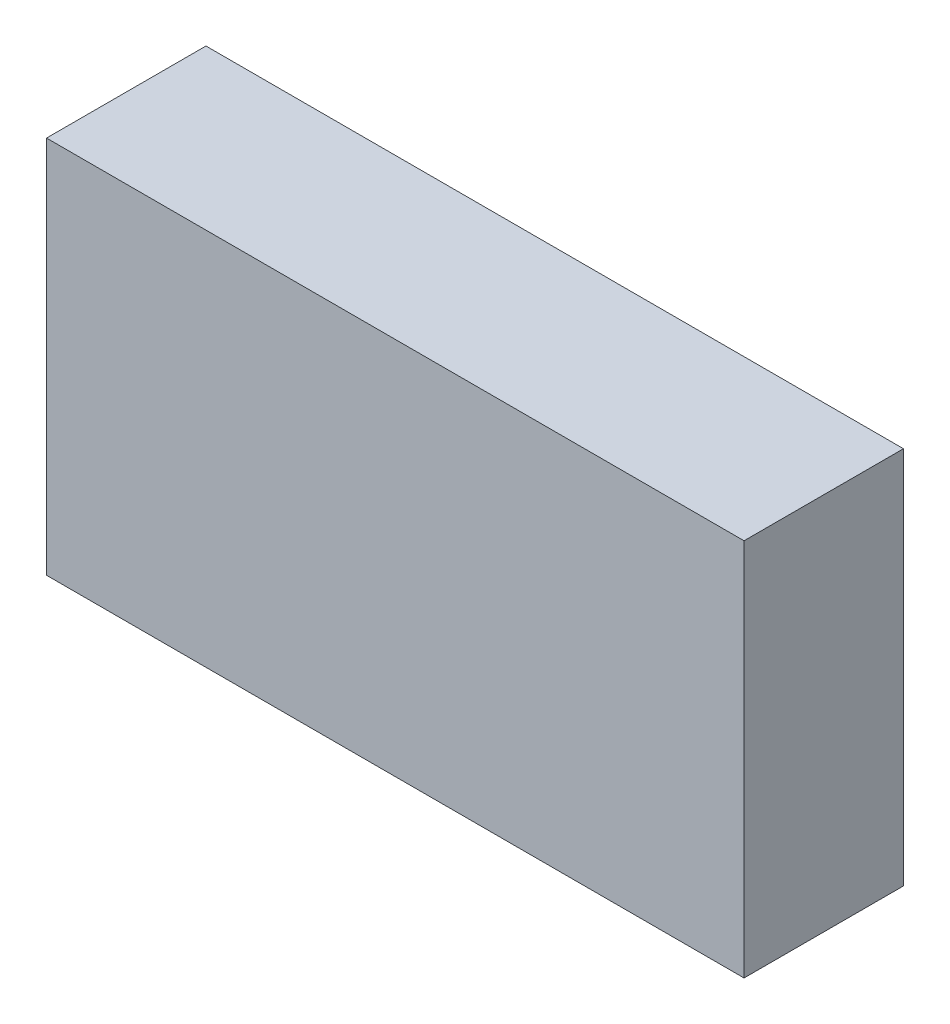
ISO-10303-21;
HEADER;
FILE_DESCRIPTION(('STEP AP214'),'2;1');
FILE_NAME('part.step','',(''),(''),'','','');
FILE_SCHEMA(('AUTOMOTIVE_DESIGN { 1 0 10303 214 1 1 1 1 }'));
ENDSEC;
DATA;
#1=APPLICATION_CONTEXT('core data for automotive mechanical design processes');
#2=APPLICATION_PROTOCOL_DEFINITION('international standard','automotive_design',2000,#1);
#3=PRODUCT_CONTEXT('',#1,'mechanical');
#4=PRODUCT('Part','Part','',(#3));
#5=PRODUCT_RELATED_PRODUCT_CATEGORY('part','',(#4));
#6=PRODUCT_DEFINITION_FORMATION('','',#4);
#7=PRODUCT_DEFINITION_CONTEXT('part definition',#1,'design');
#8=PRODUCT_DEFINITION('design','',#6,#7);
#9=PRODUCT_DEFINITION_SHAPE('','',#8);
#10=(LENGTH_UNIT() NAMED_UNIT(*) SI_UNIT(.MILLI.,.METRE.));
#11=(NAMED_UNIT(*) PLANE_ANGLE_UNIT() SI_UNIT($,.RADIAN.));
#12=(NAMED_UNIT(*) SI_UNIT($,.STERADIAN.) SOLID_ANGLE_UNIT());
#13=UNCERTAINTY_MEASURE_WITH_UNIT(LENGTH_MEASURE(1.E-05),#10,'distance_accuracy_value','');
#14=(GEOMETRIC_REPRESENTATION_CONTEXT(3) GLOBAL_UNCERTAINTY_ASSIGNED_CONTEXT((#13)) GLOBAL_UNIT_ASSIGNED_CONTEXT((#10,
#11,#12)) REPRESENTATION_CONTEXT('',''));
#15=CARTESIAN_POINT('',(0.,0.,0.));
#16=DIRECTION('',(0.,0.,1.));
#17=DIRECTION('',(1.,0.,0.));
#18=AXIS2_PLACEMENT_3D('',#15,#16,#17);
#19=CARTESIAN_POINT('',(-0.875,0.475,0.4));
#20=DIRECTION('',(1.,0.,0.));
#21=DIRECTION('',(0.,0.,-1.));
#22=AXIS2_PLACEMENT_3D('',#19,#20,#21);
#23=PLANE('',#22);
#24=DIRECTION('',(0.,-1.,0.));
#25=VECTOR('',#24,1.);
#26=CARTESIAN_POINT('',(-0.875,0.475,0.));
#27=LINE('',#26,#25);
#28=CARTESIAN_POINT('',(-0.875,0.475,0.));
#29=VERTEX_POINT('',#28);
#30=CARTESIAN_POINT('',(-0.875,-0.475,0.));
#31=VERTEX_POINT('',#30);
#32=EDGE_CURVE('E97',#29,#31,#27,.T.);
#33=ORIENTED_EDGE('',*,*,#32,.T.);
#34=DIRECTION('',(0.,0.,-1.));
#35=VECTOR('',#34,1.);
#36=CARTESIAN_POINT('',(-0.875,-0.475,0.4));
#37=LINE('',#36,#35);
#38=CARTESIAN_POINT('',(-0.875,-0.475,0.4));
#39=VERTEX_POINT('',#38);
#40=EDGE_CURVE('E11',#39,#31,#37,.T.);
#41=ORIENTED_EDGE('',*,*,#40,.F.);
#42=DIRECTION('',(0.,-1.,0.));
#43=VECTOR('',#42,1.);
#44=CARTESIAN_POINT('',(-0.875,0.475,0.4));
#45=LINE('',#44,#43);
#46=CARTESIAN_POINT('',(-0.875,0.475,0.4));
#47=VERTEX_POINT('',#46);
#48=EDGE_CURVE('E85',#47,#39,#45,.T.);
#49=ORIENTED_EDGE('',*,*,#48,.F.);
#50=DIRECTION('',(0.,0.,-1.));
#51=VECTOR('',#50,1.);
#52=CARTESIAN_POINT('',(-0.875,0.475,0.4));
#53=LINE('',#52,#51);
#54=EDGE_CURVE('E93',#47,#29,#53,.T.);
#55=ORIENTED_EDGE('',*,*,#54,.T.);
#56=EDGE_LOOP('',(#33,#41,#49,#55));
#57=FACE_BOUND('',#56,.T.);
#58=ADVANCED_FACE('F34',(#57),#23,.F.);
#59=CARTESIAN_POINT('',(-0.875,-0.475,0.4));
#60=DIRECTION('',(0.,1.,0.));
#61=DIRECTION('',(0.,0.,1.));
#62=AXIS2_PLACEMENT_3D('',#59,#60,#61);
#63=PLANE('',#62);
#64=DIRECTION('',(1.,0.,0.));
#65=VECTOR('',#64,1.);
#66=CARTESIAN_POINT('',(-0.875,-0.475,0.));
#67=LINE('',#66,#65);
#68=CARTESIAN_POINT('',(0.875,-0.475,0.));
#69=VERTEX_POINT('',#68);
#70=EDGE_CURVE('E89',#31,#69,#67,.T.);
#71=ORIENTED_EDGE('',*,*,#70,.T.);
#72=DIRECTION('',(0.,0.,-1.));
#73=VECTOR('',#72,1.);
#74=CARTESIAN_POINT('',(0.875,-0.475,0.4));
#75=LINE('',#74,#73);
#76=CARTESIAN_POINT('',(0.875,-0.475,0.4));
#77=VERTEX_POINT('',#76);
#78=EDGE_CURVE('E42',#77,#69,#75,.T.);
#79=ORIENTED_EDGE('',*,*,#78,.F.);
#80=DIRECTION('',(1.,0.,0.));
#81=VECTOR('',#80,1.);
#82=CARTESIAN_POINT('',(-0.875,-0.475,0.4));
#83=LINE('',#82,#81);
#84=EDGE_CURVE('E80',#39,#77,#83,.T.);
#85=ORIENTED_EDGE('',*,*,#84,.F.);
#86=ORIENTED_EDGE('',*,*,#40,.T.);
#87=EDGE_LOOP('',(#71,#79,#85,#86));
#88=FACE_BOUND('',#87,.T.);
#89=ADVANCED_FACE('F88',(#88),#63,.F.);
#90=CARTESIAN_POINT('',(0.875,-0.475,0.4));
#91=DIRECTION('',(-1.,0.,0.));
#92=DIRECTION('',(0.,0.,1.));
#93=AXIS2_PLACEMENT_3D('',#90,#91,#92);
#94=PLANE('',#93);
#95=DIRECTION('',(0.,1.,0.));
#96=VECTOR('',#95,1.);
#97=CARTESIAN_POINT('',(0.875,-0.475,0.));
#98=LINE('',#97,#96);
#99=CARTESIAN_POINT('',(0.875,0.475,0.));
#100=VERTEX_POINT('',#99);
#101=EDGE_CURVE('E67',#69,#100,#98,.T.);
#102=ORIENTED_EDGE('',*,*,#101,.T.);
#103=DIRECTION('',(0.,0.,-1.));
#104=VECTOR('',#103,1.);
#105=CARTESIAN_POINT('',(0.875,0.475,0.4));
#106=LINE('',#105,#104);
#107=CARTESIAN_POINT('',(0.875,0.475,0.4));
#108=VERTEX_POINT('',#107);
#109=EDGE_CURVE('E90',#108,#100,#106,.T.);
#110=ORIENTED_EDGE('',*,*,#109,.F.);
#111=DIRECTION('',(0.,1.,0.));
#112=VECTOR('',#111,1.);
#113=CARTESIAN_POINT('',(0.875,-0.475,0.4));
#114=LINE('',#113,#112);
#115=EDGE_CURVE('E83',#77,#108,#114,.T.);
#116=ORIENTED_EDGE('',*,*,#115,.F.);
#117=ORIENTED_EDGE('',*,*,#78,.T.);
#118=EDGE_LOOP('',(#102,#110,#116,#117));
#119=FACE_BOUND('',#118,.T.);
#120=ADVANCED_FACE('F91',(#119),#94,.F.);
#121=CARTESIAN_POINT('',(0.875,0.475,0.4));
#122=DIRECTION('',(0.,-1.,0.));
#123=DIRECTION('',(0.,0.,-1.));
#124=AXIS2_PLACEMENT_3D('',#121,#122,#123);
#125=PLANE('',#124);
#126=DIRECTION('',(-1.,0.,0.));
#127=VECTOR('',#126,1.);
#128=CARTESIAN_POINT('',(0.875,0.475,0.));
#129=LINE('',#128,#127);
#130=EDGE_CURVE('E73',#100,#29,#129,.T.);
#131=ORIENTED_EDGE('',*,*,#130,.T.);
#132=ORIENTED_EDGE('',*,*,#54,.F.);
#133=DIRECTION('',(-1.,0.,0.));
#134=VECTOR('',#133,1.);
#135=CARTESIAN_POINT('',(0.875,0.475,0.4));
#136=LINE('',#135,#134);
#137=EDGE_CURVE('E50',#108,#47,#136,.T.);
#138=ORIENTED_EDGE('',*,*,#137,.F.);
#139=ORIENTED_EDGE('',*,*,#109,.T.);
#140=EDGE_LOOP('',(#131,#132,#138,#139));
#141=FACE_BOUND('',#140,.T.);
#142=ADVANCED_FACE('F104',(#141),#125,.F.);
#143=CARTESIAN_POINT('',(0.,0.,0.4));
#144=DIRECTION('',(0.,0.,1.));
#145=DIRECTION('',(1.,0.,0.));
#146=AXIS2_PLACEMENT_3D('',#143,#144,#145);
#147=PLANE('',#146);
#148=ORIENTED_EDGE('',*,*,#48,.T.);
#149=ORIENTED_EDGE('',*,*,#84,.T.);
#150=ORIENTED_EDGE('',*,*,#115,.T.);
#151=ORIENTED_EDGE('',*,*,#137,.T.);
#152=EDGE_LOOP('',(#148,#149,#150,#151));
#153=FACE_BOUND('',#152,.T.);
#154=ADVANCED_FACE('F81',(#153),#147,.T.);
#155=CARTESIAN_POINT('',(0.,0.,0.));
#156=DIRECTION('',(0.,0.,1.));
#157=DIRECTION('',(1.,0.,0.));
#158=AXIS2_PLACEMENT_3D('',#155,#156,#157);
#159=PLANE('',#158);
#160=ORIENTED_EDGE('',*,*,#32,.F.);
#161=ORIENTED_EDGE('',*,*,#130,.F.);
#162=ORIENTED_EDGE('',*,*,#101,.F.);
#163=ORIENTED_EDGE('',*,*,#70,.F.);
#164=EDGE_LOOP('',(#160,#161,#162,#163));
#165=FACE_BOUND('',#164,.T.);
#166=ADVANCED_FACE('F107',(#165),#159,.F.);
#167=CLOSED_SHELL('',(#58,#89,#120,#142,#154,#166));
#168=MANIFOLD_SOLID_BREP('B2',#167);
#169=ADVANCED_BREP_SHAPE_REPRESENTATION('',(#18,#168),#14);
#170=SHAPE_DEFINITION_REPRESENTATION(#9,#169);
ENDSEC;
END-ISO-10303-21;
